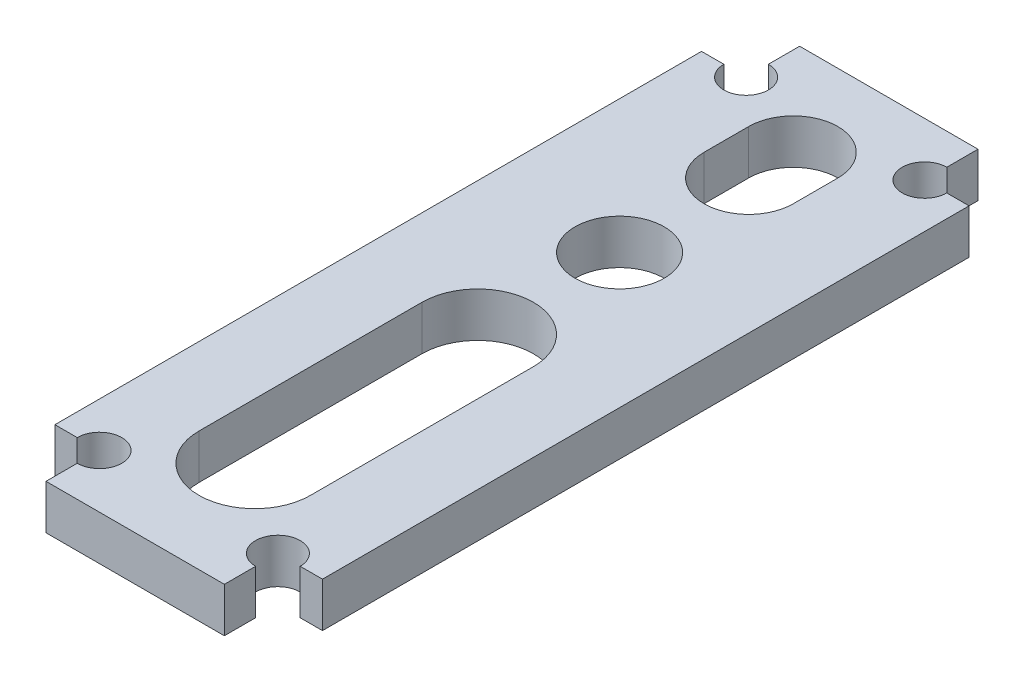
ISO-10303-21;
HEADER;
FILE_DESCRIPTION(('STEP AP214'),'2;1');
FILE_NAME('part.step','',(''),(''),'','','');
FILE_SCHEMA(('AUTOMOTIVE_DESIGN { 1 0 10303 214 1 1 1 1 }'));
ENDSEC;
DATA;
#1=APPLICATION_CONTEXT('core data for automotive mechanical design processes');
#2=APPLICATION_PROTOCOL_DEFINITION('international standard','automotive_design',2000,#1);
#3=PRODUCT_CONTEXT('',#1,'mechanical');
#4=PRODUCT('Part','Part','',(#3));
#5=PRODUCT_RELATED_PRODUCT_CATEGORY('part','',(#4));
#6=PRODUCT_DEFINITION_FORMATION('','',#4);
#7=PRODUCT_DEFINITION_CONTEXT('part definition',#1,'design');
#8=PRODUCT_DEFINITION('design','',#6,#7);
#9=PRODUCT_DEFINITION_SHAPE('','',#8);
#10=(LENGTH_UNIT() NAMED_UNIT(*) SI_UNIT(.MILLI.,.METRE.));
#11=(NAMED_UNIT(*) PLANE_ANGLE_UNIT() SI_UNIT($,.RADIAN.));
#12=(NAMED_UNIT(*) SI_UNIT($,.STERADIAN.) SOLID_ANGLE_UNIT());
#13=UNCERTAINTY_MEASURE_WITH_UNIT(LENGTH_MEASURE(1.E-05),#10,'distance_accuracy_value','');
#14=(GEOMETRIC_REPRESENTATION_CONTEXT(3) GLOBAL_UNCERTAINTY_ASSIGNED_CONTEXT((#13)) GLOBAL_UNIT_ASSIGNED_CONTEXT((#10,
#11,#12)) REPRESENTATION_CONTEXT('',''));
#15=CARTESIAN_POINT('',(0.,0.,0.));
#16=DIRECTION('',(0.,0.,1.));
#17=DIRECTION('',(1.,0.,0.));
#18=AXIS2_PLACEMENT_3D('',#15,#16,#17);
#19=CARTESIAN_POINT('',(1.99999999999987,1.,-15.3877447895864));
#20=DIRECTION('',(0.,-1.,0.));
#21=DIRECTION('',(0.,0.,-1.));
#22=AXIS2_PLACEMENT_3D('',#19,#20,#21);
#23=CYLINDRICAL_SURFACE('',#22,0.5);
#24=CARTESIAN_POINT('',(1.99999999999987,0.,-15.3877447895864));
#25=DIRECTION('',(0.,1.,0.));
#26=DIRECTION('',(0.,0.,1.));
#27=AXIS2_PLACEMENT_3D('',#24,#25,#26);
#28=CIRCLE('',#27,0.5);
#29=CARTESIAN_POINT('',(1.99999999999992,0.,-15.8877447895864));
#30=VERTEX_POINT('',#29);
#31=CARTESIAN_POINT('',(2.49999999999987,0.,-15.3877447895864));
#32=VERTEX_POINT('',#31);
#33=EDGE_CURVE('E316',#30,#32,#28,.T.);
#34=ORIENTED_EDGE('',*,*,#33,.F.);
#35=DIRECTION('',(0.,-1.,0.));
#36=VECTOR('',#35,1.);
#37=CARTESIAN_POINT('',(1.99999999999992,1.,-15.8877447895864));
#38=LINE('',#37,#36);
#39=CARTESIAN_POINT('',(1.99999999999992,1.,-15.8877447895864));
#40=VERTEX_POINT('',#39);
#41=EDGE_CURVE('E11',#40,#30,#38,.T.);
#42=ORIENTED_EDGE('',*,*,#41,.F.);
#43=CARTESIAN_POINT('',(1.99999999999987,1.,-15.3877447895864));
#44=DIRECTION('',(0.,1.,0.));
#45=DIRECTION('',(0.,0.,1.));
#46=AXIS2_PLACEMENT_3D('',#43,#44,#45);
#47=CIRCLE('',#46,0.5);
#48=CARTESIAN_POINT('',(2.49999999999987,1.,-15.3877447895864));
#49=VERTEX_POINT('',#48);
#50=EDGE_CURVE('E383',#40,#49,#47,.T.);
#51=ORIENTED_EDGE('',*,*,#50,.T.);
#52=DIRECTION('',(0.,-1.,0.));
#53=VECTOR('',#52,1.);
#54=CARTESIAN_POINT('',(2.49999999999987,1.,-15.3877447895864));
#55=LINE('',#54,#53);
#56=EDGE_CURVE('E62',#49,#32,#55,.T.);
#57=ORIENTED_EDGE('',*,*,#56,.T.);
#58=EDGE_LOOP('',(#34,#42,#51,#57));
#59=FACE_BOUND('',#58,.T.);
#60=ADVANCED_FACE('F43',(#59),#23,.F.);
#61=CARTESIAN_POINT('',(1.99999999999991,1.,0.));
#62=DIRECTION('',(1.,0.,0.));
#63=DIRECTION('',(0.,0.,-1.));
#64=AXIS2_PLACEMENT_3D('',#61,#62,#63);
#65=PLANE('',#64);
#66=DIRECTION('',(0.,0.,1.));
#67=VECTOR('',#66,1.);
#68=CARTESIAN_POINT('',(1.99999999999991,0.,0.));
#69=LINE('',#68,#67);
#70=CARTESIAN_POINT('',(1.99999999999992,0.,-16.5877447895851));
#71=VERTEX_POINT('',#70);
#72=EDGE_CURVE('E318',#71,#30,#69,.T.);
#73=ORIENTED_EDGE('',*,*,#72,.F.);
#74=DIRECTION('',(0.,-1.,0.));
#75=VECTOR('',#74,1.);
#76=CARTESIAN_POINT('',(1.99999999999992,1.,-16.5877447895851));
#77=LINE('',#76,#75);
#78=CARTESIAN_POINT('',(1.99999999999992,1.,-16.5877447895851));
#79=VERTEX_POINT('',#78);
#80=EDGE_CURVE('E53',#79,#71,#77,.T.);
#81=ORIENTED_EDGE('',*,*,#80,.F.);
#82=DIRECTION('',(0.,0.,1.));
#83=VECTOR('',#82,1.);
#84=CARTESIAN_POINT('',(1.99999999999991,1.,0.));
#85=LINE('',#84,#83);
#86=EDGE_CURVE('E385',#79,#40,#85,.T.);
#87=ORIENTED_EDGE('',*,*,#86,.T.);
#88=ORIENTED_EDGE('',*,*,#41,.T.);
#89=EDGE_LOOP('',(#73,#81,#87,#88));
#90=FACE_BOUND('',#89,.T.);
#91=ADVANCED_FACE('F434',(#90),#65,.T.);
#92=CARTESIAN_POINT('',(0.,1.,-16.5877447895851));
#93=DIRECTION('',(0.,0.,-1.));
#94=DIRECTION('',(-1.,0.,0.));
#95=AXIS2_PLACEMENT_3D('',#92,#93,#94);
#96=PLANE('',#95);
#97=DIRECTION('',(1.,0.,0.));
#98=VECTOR('',#97,1.);
#99=CARTESIAN_POINT('',(0.,0.,-16.5877447895851));
#100=LINE('',#99,#98);
#101=CARTESIAN_POINT('',(-2.,0.,-16.5877447895851));
#102=VERTEX_POINT('',#101);
#103=EDGE_CURVE('E321',#102,#71,#100,.T.);
#104=ORIENTED_EDGE('',*,*,#103,.F.);
#105=DIRECTION('',(0.,-1.,0.));
#106=VECTOR('',#105,1.);
#107=CARTESIAN_POINT('',(-2.,1.,-16.5877447895851));
#108=LINE('',#107,#106);
#109=CARTESIAN_POINT('',(-2.,1.,-16.5877447895851));
#110=VERTEX_POINT('',#109);
#111=EDGE_CURVE('E260',#110,#102,#108,.T.);
#112=ORIENTED_EDGE('',*,*,#111,.F.);
#113=DIRECTION('',(1.,0.,0.));
#114=VECTOR('',#113,1.);
#115=CARTESIAN_POINT('',(0.,1.,-16.5877447895851));
#116=LINE('',#115,#114);
#117=EDGE_CURVE('E388',#110,#79,#116,.T.);
#118=ORIENTED_EDGE('',*,*,#117,.T.);
#119=ORIENTED_EDGE('',*,*,#80,.T.);
#120=EDGE_LOOP('',(#104,#112,#118,#119));
#121=FACE_BOUND('',#120,.T.);
#122=ADVANCED_FACE('F439',(#121),#96,.T.);
#123=CARTESIAN_POINT('',(-2.,1.,0.));
#124=DIRECTION('',(-1.,0.,0.));
#125=DIRECTION('',(0.,0.,1.));
#126=AXIS2_PLACEMENT_3D('',#123,#124,#125);
#127=PLANE('',#126);
#128=DIRECTION('',(0.,0.,-1.));
#129=VECTOR('',#128,1.);
#130=CARTESIAN_POINT('',(-2.,0.,0.));
#131=LINE('',#130,#129);
#132=CARTESIAN_POINT('',(-2.,0.,-15.8877447895865));
#133=VERTEX_POINT('',#132);
#134=EDGE_CURVE('E324',#133,#102,#131,.T.);
#135=ORIENTED_EDGE('',*,*,#134,.F.);
#136=DIRECTION('',(0.,-1.,0.));
#137=VECTOR('',#136,1.);
#138=CARTESIAN_POINT('',(-2.,1.,-15.8877447895865));
#139=LINE('',#138,#137);
#140=CARTESIAN_POINT('',(-2.,1.,-15.8877447895865));
#141=VERTEX_POINT('',#140);
#142=EDGE_CURVE('E258',#141,#133,#139,.T.);
#143=ORIENTED_EDGE('',*,*,#142,.F.);
#144=DIRECTION('',(0.,0.,-1.));
#145=VECTOR('',#144,1.);
#146=CARTESIAN_POINT('',(-2.,1.,0.));
#147=LINE('',#146,#145);
#148=EDGE_CURVE('E391',#141,#110,#147,.T.);
#149=ORIENTED_EDGE('',*,*,#148,.T.);
#150=ORIENTED_EDGE('',*,*,#111,.T.);
#151=EDGE_LOOP('',(#135,#143,#149,#150));
#152=FACE_BOUND('',#151,.T.);
#153=ADVANCED_FACE('F583',(#152),#127,.T.);
#154=CARTESIAN_POINT('',(-2.00000000000013,1.,-15.3877447895864));
#155=DIRECTION('',(0.,-1.,0.));
#156=DIRECTION('',(0.,0.,-1.));
#157=AXIS2_PLACEMENT_3D('',#154,#155,#156);
#158=CYLINDRICAL_SURFACE('',#157,0.500000000000018);
#159=CARTESIAN_POINT('',(-2.00000000000013,0.,-15.3877447895864));
#160=DIRECTION('',(0.,1.,0.));
#161=DIRECTION('',(0.,0.,1.));
#162=AXIS2_PLACEMENT_3D('',#159,#160,#161);
#163=CIRCLE('',#162,0.500000000000018);
#164=CARTESIAN_POINT('',(-2.50000000000014,0.,-15.3877447895859));
#165=VERTEX_POINT('',#164);
#166=EDGE_CURVE('E327',#165,#133,#163,.T.);
#167=ORIENTED_EDGE('',*,*,#166,.F.);
#168=DIRECTION('',(0.,-1.,0.));
#169=VECTOR('',#168,1.);
#170=CARTESIAN_POINT('',(-2.50000000000014,1.,-15.3877447895859));
#171=LINE('',#170,#169);
#172=CARTESIAN_POINT('',(-2.50000000000014,1.,-15.3877447895859));
#173=VERTEX_POINT('',#172);
#174=EDGE_CURVE('E256',#173,#165,#171,.T.);
#175=ORIENTED_EDGE('',*,*,#174,.F.);
#176=CARTESIAN_POINT('',(-2.00000000000013,1.,-15.3877447895864));
#177=DIRECTION('',(0.,1.,0.));
#178=DIRECTION('',(0.,0.,1.));
#179=AXIS2_PLACEMENT_3D('',#176,#177,#178);
#180=CIRCLE('',#179,0.500000000000018);
#181=EDGE_CURVE('E394',#173,#141,#180,.T.);
#182=ORIENTED_EDGE('',*,*,#181,.T.);
#183=ORIENTED_EDGE('',*,*,#142,.T.);
#184=EDGE_LOOP('',(#167,#175,#182,#183));
#185=FACE_BOUND('',#184,.T.);
#186=ADVANCED_FACE('F573',(#185),#158,.F.);
#187=CARTESIAN_POINT('',(0.,1.,-15.3877447895859));
#188=DIRECTION('',(0.,0.,-1.));
#189=DIRECTION('',(-1.,0.,0.));
#190=AXIS2_PLACEMENT_3D('',#187,#188,#189);
#191=PLANE('',#190);
#192=DIRECTION('',(1.,0.,0.));
#193=VECTOR('',#192,1.);
#194=CARTESIAN_POINT('',(0.,0.,-15.3877447895859));
#195=LINE('',#194,#193);
#196=CARTESIAN_POINT('',(-3.,0.,-15.3877447895859));
#197=VERTEX_POINT('',#196);
#198=EDGE_CURVE('E330',#197,#165,#195,.T.);
#199=ORIENTED_EDGE('',*,*,#198,.F.);
#200=DIRECTION('',(0.,-1.,0.));
#201=VECTOR('',#200,1.);
#202=CARTESIAN_POINT('',(-3.,1.,-15.3877447895859));
#203=LINE('',#202,#201);
#204=CARTESIAN_POINT('',(-3.,1.,-15.3877447895859));
#205=VERTEX_POINT('',#204);
#206=EDGE_CURVE('E254',#205,#197,#203,.T.);
#207=ORIENTED_EDGE('',*,*,#206,.F.);
#208=DIRECTION('',(1.,0.,0.));
#209=VECTOR('',#208,1.);
#210=CARTESIAN_POINT('',(0.,1.,-15.3877447895859));
#211=LINE('',#210,#209);
#212=EDGE_CURVE('E397',#205,#173,#211,.T.);
#213=ORIENTED_EDGE('',*,*,#212,.T.);
#214=ORIENTED_EDGE('',*,*,#174,.T.);
#215=EDGE_LOOP('',(#199,#207,#213,#214));
#216=FACE_BOUND('',#215,.T.);
#217=ADVANCED_FACE('F564',(#216),#191,.T.);
#218=CARTESIAN_POINT('',(-3.,1.,0.));
#219=DIRECTION('',(-1.,0.,0.));
#220=DIRECTION('',(0.,0.,1.));
#221=AXIS2_PLACEMENT_3D('',#218,#219,#220);
#222=PLANE('',#221);
#223=DIRECTION('',(0.,0.,-1.));
#224=VECTOR('',#223,1.);
#225=CARTESIAN_POINT('',(-3.,0.,0.));
#226=LINE('',#225,#224);
#227=CARTESIAN_POINT('',(-3.,0.,-0.887766191886832));
#228=VERTEX_POINT('',#227);
#229=EDGE_CURVE('E333',#228,#197,#226,.T.);
#230=ORIENTED_EDGE('',*,*,#229,.F.);
#231=DIRECTION('',(0.,-1.,0.));
#232=VECTOR('',#231,1.);
#233=CARTESIAN_POINT('',(-3.,1.,-0.887766191886832));
#234=LINE('',#233,#232);
#235=CARTESIAN_POINT('',(-3.,1.,-0.887766191886832));
#236=VERTEX_POINT('',#235);
#237=EDGE_CURVE('E252',#236,#228,#234,.T.);
#238=ORIENTED_EDGE('',*,*,#237,.F.);
#239=DIRECTION('',(0.,0.,-1.));
#240=VECTOR('',#239,1.);
#241=CARTESIAN_POINT('',(-3.,1.,0.));
#242=LINE('',#241,#240);
#243=EDGE_CURVE('E400',#236,#205,#242,.T.);
#244=ORIENTED_EDGE('',*,*,#243,.T.);
#245=ORIENTED_EDGE('',*,*,#206,.T.);
#246=EDGE_LOOP('',(#230,#238,#244,#245));
#247=FACE_BOUND('',#246,.T.);
#248=ADVANCED_FACE('F555',(#247),#222,.T.);
#249=CARTESIAN_POINT('',(0.,1.,-0.887766191886833));
#250=DIRECTION('',(0.,0.,-1.));
#251=DIRECTION('',(-1.,0.,0.));
#252=AXIS2_PLACEMENT_3D('',#249,#250,#251);
#253=PLANE('',#252);
#254=DIRECTION('',(1.,0.,0.));
#255=VECTOR('',#254,1.);
#256=CARTESIAN_POINT('',(0.,0.,-0.887766191886833));
#257=LINE('',#256,#255);
#258=CARTESIAN_POINT('',(-2.50000000000004,0.,-0.887766191886832));
#259=VERTEX_POINT('',#258);
#260=EDGE_CURVE('E336',#228,#259,#257,.T.);
#261=ORIENTED_EDGE('',*,*,#260,.T.);
#262=DIRECTION('',(0.,-1.,0.));
#263=VECTOR('',#262,1.);
#264=CARTESIAN_POINT('',(-2.50000000000004,1.,-0.887766191886832));
#265=LINE('',#264,#263);
#266=CARTESIAN_POINT('',(-2.50000000000004,1.,-0.887766191886832));
#267=VERTEX_POINT('',#266);
#268=EDGE_CURVE('E250',#267,#259,#265,.T.);
#269=ORIENTED_EDGE('',*,*,#268,.F.);
#270=DIRECTION('',(1.,0.,0.));
#271=VECTOR('',#270,1.);
#272=CARTESIAN_POINT('',(0.,1.,-0.887766191886833));
#273=LINE('',#272,#271);
#274=EDGE_CURVE('E403',#236,#267,#273,.T.);
#275=ORIENTED_EDGE('',*,*,#274,.F.);
#276=ORIENTED_EDGE('',*,*,#237,.T.);
#277=EDGE_LOOP('',(#261,#269,#275,#276));
#278=FACE_BOUND('',#277,.T.);
#279=ADVANCED_FACE('F546',(#278),#253,.F.);
#280=CARTESIAN_POINT('',(-2.00000000000004,1.,-0.887766191886832));
#281=DIRECTION('',(0.,-1.,0.));
#282=DIRECTION('',(0.,0.,-1.));
#283=AXIS2_PLACEMENT_3D('',#280,#281,#282);
#284=CYLINDRICAL_SURFACE('',#283,0.5);
#285=CARTESIAN_POINT('',(-2.00000000000004,0.,-0.887766191886832));
#286=DIRECTION('',(0.,1.,0.));
#287=DIRECTION('',(0.,0.,1.));
#288=AXIS2_PLACEMENT_3D('',#285,#286,#287);
#289=CIRCLE('',#288,0.5);
#290=CARTESIAN_POINT('',(-2.00000000000004,0.,-0.387766191886832));
#291=VERTEX_POINT('',#290);
#292=EDGE_CURVE('E339',#291,#259,#289,.T.);
#293=ORIENTED_EDGE('',*,*,#292,.F.);
#294=DIRECTION('',(0.,-1.,0.));
#295=VECTOR('',#294,1.);
#296=CARTESIAN_POINT('',(-2.00000000000004,1.,-0.387766191886832));
#297=LINE('',#296,#295);
#298=CARTESIAN_POINT('',(-2.00000000000004,1.,-0.387766191886832));
#299=VERTEX_POINT('',#298);
#300=EDGE_CURVE('E248',#299,#291,#297,.T.);
#301=ORIENTED_EDGE('',*,*,#300,.F.);
#302=CARTESIAN_POINT('',(-2.00000000000004,1.,-0.887766191886832));
#303=DIRECTION('',(0.,1.,0.));
#304=DIRECTION('',(0.,0.,1.));
#305=AXIS2_PLACEMENT_3D('',#302,#303,#304);
#306=CIRCLE('',#305,0.5);
#307=EDGE_CURVE('E405',#299,#267,#306,.T.);
#308=ORIENTED_EDGE('',*,*,#307,.T.);
#309=ORIENTED_EDGE('',*,*,#268,.T.);
#310=EDGE_LOOP('',(#293,#301,#308,#309));
#311=FACE_BOUND('',#310,.T.);
#312=ADVANCED_FACE('F537',(#311),#284,.F.);
#313=CARTESIAN_POINT('',(-2.00000000000004,1.,0.));
#314=DIRECTION('',(1.,0.,0.));
#315=DIRECTION('',(0.,0.,-1.));
#316=AXIS2_PLACEMENT_3D('',#313,#314,#315);
#317=PLANE('',#316);
#318=DIRECTION('',(0.,0.,1.));
#319=VECTOR('',#318,1.);
#320=CARTESIAN_POINT('',(-2.00000000000004,0.,0.));
#321=LINE('',#320,#319);
#322=CARTESIAN_POINT('',(-2.00000000000004,0.,0.312233808113167));
#323=VERTEX_POINT('',#322);
#324=EDGE_CURVE('E342',#291,#323,#321,.T.);
#325=ORIENTED_EDGE('',*,*,#324,.T.);
#326=DIRECTION('',(0.,-1.,0.));
#327=VECTOR('',#326,1.);
#328=CARTESIAN_POINT('',(-2.00000000000004,1.,0.312233808113167));
#329=LINE('',#328,#327);
#330=CARTESIAN_POINT('',(-2.00000000000004,1.,0.312233808113167));
#331=VERTEX_POINT('',#330);
#332=EDGE_CURVE('E245',#331,#323,#329,.T.);
#333=ORIENTED_EDGE('',*,*,#332,.F.);
#334=DIRECTION('',(0.,0.,1.));
#335=VECTOR('',#334,1.);
#336=CARTESIAN_POINT('',(-2.00000000000004,1.,0.));
#337=LINE('',#336,#335);
#338=EDGE_CURVE('E408',#299,#331,#337,.T.);
#339=ORIENTED_EDGE('',*,*,#338,.F.);
#340=ORIENTED_EDGE('',*,*,#300,.T.);
#341=EDGE_LOOP('',(#325,#333,#339,#340));
#342=FACE_BOUND('',#341,.T.);
#343=ADVANCED_FACE('F528',(#342),#317,.F.);
#344=CARTESIAN_POINT('',(0.,1.,0.312233808113167));
#345=DIRECTION('',(0.,0.,-1.));
#346=DIRECTION('',(-1.,0.,0.));
#347=AXIS2_PLACEMENT_3D('',#344,#345,#346);
#348=PLANE('',#347);
#349=DIRECTION('',(1.,0.,0.));
#350=VECTOR('',#349,1.);
#351=CARTESIAN_POINT('',(0.,0.,0.312233808113167));
#352=LINE('',#351,#350);
#353=CARTESIAN_POINT('',(2.,0.,0.312233808113167));
#354=VERTEX_POINT('',#353);
#355=EDGE_CURVE('E345',#323,#354,#352,.T.);
#356=ORIENTED_EDGE('',*,*,#355,.T.);
#357=DIRECTION('',(0.,-1.,0.));
#358=VECTOR('',#357,1.);
#359=CARTESIAN_POINT('',(2.,1.,0.312233808113167));
#360=LINE('',#359,#358);
#361=CARTESIAN_POINT('',(2.,1.,0.312233808113167));
#362=VERTEX_POINT('',#361);
#363=EDGE_CURVE('E242',#362,#354,#360,.T.);
#364=ORIENTED_EDGE('',*,*,#363,.F.);
#365=DIRECTION('',(1.,0.,0.));
#366=VECTOR('',#365,1.);
#367=CARTESIAN_POINT('',(0.,1.,0.312233808113167));
#368=LINE('',#367,#366);
#369=EDGE_CURVE('E411',#331,#362,#368,.T.);
#370=ORIENTED_EDGE('',*,*,#369,.F.);
#371=ORIENTED_EDGE('',*,*,#332,.T.);
#372=EDGE_LOOP('',(#356,#364,#370,#371));
#373=FACE_BOUND('',#372,.T.);
#374=ADVANCED_FACE('F519',(#373),#348,.F.);
#375=CARTESIAN_POINT('',(2.,1.,0.));
#376=DIRECTION('',(-1.,0.,0.));
#377=DIRECTION('',(0.,0.,1.));
#378=AXIS2_PLACEMENT_3D('',#375,#376,#377);
#379=PLANE('',#378);
#380=DIRECTION('',(0.,0.,-1.));
#381=VECTOR('',#380,1.);
#382=CARTESIAN_POINT('',(2.,0.,0.));
#383=LINE('',#382,#381);
#384=CARTESIAN_POINT('',(2.,0.,-0.387766191886833));
#385=VERTEX_POINT('',#384);
#386=EDGE_CURVE('E348',#354,#385,#383,.T.);
#387=ORIENTED_EDGE('',*,*,#386,.T.);
#388=DIRECTION('',(0.,-1.,0.));
#389=VECTOR('',#388,1.);
#390=CARTESIAN_POINT('',(2.,1.,-0.387766191886833));
#391=LINE('',#390,#389);
#392=CARTESIAN_POINT('',(2.,1.,-0.387766191886833));
#393=VERTEX_POINT('',#392);
#394=EDGE_CURVE('E236',#393,#385,#391,.T.);
#395=ORIENTED_EDGE('',*,*,#394,.F.);
#396=DIRECTION('',(0.,0.,-1.));
#397=VECTOR('',#396,1.);
#398=CARTESIAN_POINT('',(2.,1.,0.));
#399=LINE('',#398,#397);
#400=EDGE_CURVE('E414',#362,#393,#399,.T.);
#401=ORIENTED_EDGE('',*,*,#400,.F.);
#402=ORIENTED_EDGE('',*,*,#363,.T.);
#403=EDGE_LOOP('',(#387,#395,#401,#402));
#404=FACE_BOUND('',#403,.T.);
#405=ADVANCED_FACE('F510',(#404),#379,.F.);
#406=CARTESIAN_POINT('',(2.,1.,-0.887766191886833));
#407=DIRECTION('',(0.,-1.,0.));
#408=DIRECTION('',(0.,0.,-1.));
#409=AXIS2_PLACEMENT_3D('',#406,#407,#408);
#410=CYLINDRICAL_SURFACE('',#409,0.5);
#411=CARTESIAN_POINT('',(2.,0.,-0.887766191886833));
#412=DIRECTION('',(0.,1.,0.));
#413=DIRECTION('',(0.,0.,1.));
#414=AXIS2_PLACEMENT_3D('',#411,#412,#413);
#415=CIRCLE('',#414,0.5);
#416=CARTESIAN_POINT('',(2.5,0.,-0.887766191886833));
#417=VERTEX_POINT('',#416);
#418=EDGE_CURVE('E351',#417,#385,#415,.T.);
#419=ORIENTED_EDGE('',*,*,#418,.F.);
#420=DIRECTION('',(0.,-1.,0.));
#421=VECTOR('',#420,1.);
#422=CARTESIAN_POINT('',(2.5,1.,-0.887766191886833));
#423=LINE('',#422,#421);
#424=CARTESIAN_POINT('',(2.5,1.,-0.887766191886833));
#425=VERTEX_POINT('',#424);
#426=EDGE_CURVE('E234',#425,#417,#423,.T.);
#427=ORIENTED_EDGE('',*,*,#426,.F.);
#428=CARTESIAN_POINT('',(2.,1.,-0.887766191886833));
#429=DIRECTION('',(0.,1.,0.));
#430=DIRECTION('',(0.,0.,1.));
#431=AXIS2_PLACEMENT_3D('',#428,#429,#430);
#432=CIRCLE('',#431,0.5);
#433=EDGE_CURVE('E228',#425,#393,#432,.T.);
#434=ORIENTED_EDGE('',*,*,#433,.T.);
#435=ORIENTED_EDGE('',*,*,#394,.T.);
#436=EDGE_LOOP('',(#419,#427,#434,#435));
#437=FACE_BOUND('',#436,.T.);
#438=ADVANCED_FACE('F501',(#437),#410,.F.);
#439=CARTESIAN_POINT('',(0.,1.,-0.887766191886833));
#440=DIRECTION('',(0.,0.,-1.));
#441=DIRECTION('',(-1.,0.,0.));
#442=AXIS2_PLACEMENT_3D('',#439,#440,#441);
#443=PLANE('',#442);
#444=DIRECTION('',(1.,0.,0.));
#445=VECTOR('',#444,1.);
#446=CARTESIAN_POINT('',(0.,0.,-0.887766191886833));
#447=LINE('',#446,#445);
#448=CARTESIAN_POINT('',(3.,0.,-0.887766191886833));
#449=VERTEX_POINT('',#448);
#450=EDGE_CURVE('E233',#417,#449,#447,.T.);
#451=ORIENTED_EDGE('',*,*,#450,.T.);
#452=DIRECTION('',(0.,-1.,0.));
#453=VECTOR('',#452,1.);
#454=CARTESIAN_POINT('',(3.,1.,-0.887766191886833));
#455=LINE('',#454,#453);
#456=CARTESIAN_POINT('',(3.,1.,-0.887766191886833));
#457=VERTEX_POINT('',#456);
#458=EDGE_CURVE('E215',#457,#449,#455,.T.);
#459=ORIENTED_EDGE('',*,*,#458,.F.);
#460=DIRECTION('',(1.,0.,0.));
#461=VECTOR('',#460,1.);
#462=CARTESIAN_POINT('',(0.,1.,-0.887766191886833));
#463=LINE('',#462,#461);
#464=EDGE_CURVE('E220',#425,#457,#463,.T.);
#465=ORIENTED_EDGE('',*,*,#464,.F.);
#466=ORIENTED_EDGE('',*,*,#426,.T.);
#467=EDGE_LOOP('',(#451,#459,#465,#466));
#468=FACE_BOUND('',#467,.T.);
#469=ADVANCED_FACE('F231',(#468),#443,.F.);
#470=CARTESIAN_POINT('',(3.,1.,0.));
#471=DIRECTION('',(-1.,0.,0.));
#472=DIRECTION('',(0.,0.,1.));
#473=AXIS2_PLACEMENT_3D('',#470,#471,#472);
#474=PLANE('',#473);
#475=DIRECTION('',(0.,0.,-1.));
#476=VECTOR('',#475,1.);
#477=CARTESIAN_POINT('',(3.,0.,0.));
#478=LINE('',#477,#476);
#479=CARTESIAN_POINT('',(3.,0.,-15.3877447895864));
#480=VERTEX_POINT('',#479);
#481=EDGE_CURVE('E355',#449,#480,#478,.T.);
#482=ORIENTED_EDGE('',*,*,#481,.T.);
#483=DIRECTION('',(0.,-1.,0.));
#484=VECTOR('',#483,1.);
#485=CARTESIAN_POINT('',(3.,1.,-15.3877447895864));
#486=LINE('',#485,#484);
#487=CARTESIAN_POINT('',(3.,1.,-15.3877447895864));
#488=VERTEX_POINT('',#487);
#489=EDGE_CURVE('E136',#488,#480,#486,.T.);
#490=ORIENTED_EDGE('',*,*,#489,.F.);
#491=DIRECTION('',(0.,0.,-1.));
#492=VECTOR('',#491,1.);
#493=CARTESIAN_POINT('',(3.,1.,0.));
#494=LINE('',#493,#492);
#495=EDGE_CURVE('E211',#457,#488,#494,.T.);
#496=ORIENTED_EDGE('',*,*,#495,.F.);
#497=ORIENTED_EDGE('',*,*,#458,.T.);
#498=EDGE_LOOP('',(#482,#490,#496,#497));
#499=FACE_BOUND('',#498,.T.);
#500=ADVANCED_FACE('F213',(#499),#474,.F.);
#501=CARTESIAN_POINT('',(-0.0118291814059923,1.,-7.38054704726461));
#502=DIRECTION('',(0.,-1.,0.));
#503=DIRECTION('',(0.,0.,-1.));
#504=AXIS2_PLACEMENT_3D('',#501,#502,#503);
#505=CYLINDRICAL_SURFACE('',#504,1.25);
#506=CARTESIAN_POINT('',(-0.0118291814059923,0.,-7.38054704726461));
#507=DIRECTION('',(0.,1.,0.));
#508=DIRECTION('',(0.,0.,1.));
#509=AXIS2_PLACEMENT_3D('',#506,#507,#508);
#510=CIRCLE('',#509,1.25);
#511=CARTESIAN_POINT('',(1.23817081859401,0.,-7.38054704726461));
#512=VERTEX_POINT('',#511);
#513=CARTESIAN_POINT('',(-1.26182918140599,0.,-7.38054704726461));
#514=VERTEX_POINT('',#513);
#515=EDGE_CURVE('E304',#512,#514,#510,.T.);
#516=ORIENTED_EDGE('',*,*,#515,.F.);
#517=DIRECTION('',(0.,-1.,0.));
#518=VECTOR('',#517,1.);
#519=CARTESIAN_POINT('',(1.23817081859401,1.,-7.38054704726461));
#520=LINE('',#519,#518);
#521=CARTESIAN_POINT('',(1.23817081859401,1.,-7.38054704726461));
#522=VERTEX_POINT('',#521);
#523=EDGE_CURVE('E269',#522,#512,#520,.T.);
#524=ORIENTED_EDGE('',*,*,#523,.F.);
#525=CARTESIAN_POINT('',(-0.0118291814059923,1.,-7.38054704726461));
#526=DIRECTION('',(0.,1.,0.));
#527=DIRECTION('',(0.,0.,1.));
#528=AXIS2_PLACEMENT_3D('',#525,#526,#527);
#529=CIRCLE('',#528,1.25);
#530=CARTESIAN_POINT('',(-1.26182918140599,1.,-7.38054704726461));
#531=VERTEX_POINT('',#530);
#532=EDGE_CURVE('E372',#522,#531,#529,.T.);
#533=ORIENTED_EDGE('',*,*,#532,.T.);
#534=DIRECTION('',(0.,-1.,0.));
#535=VECTOR('',#534,1.);
#536=CARTESIAN_POINT('',(-1.26182918140599,1.,-7.38054704726461));
#537=LINE('',#536,#535);
#538=EDGE_CURVE('E263',#531,#514,#537,.T.);
#539=ORIENTED_EDGE('',*,*,#538,.T.);
#540=EDGE_LOOP('',(#516,#524,#533,#539));
#541=FACE_BOUND('',#540,.T.);
#542=ADVANCED_FACE('F456',(#541),#505,.F.);
#543=CARTESIAN_POINT('',(1.23817081859401,1.,0.));
#544=DIRECTION('',(-1.,0.,0.));
#545=DIRECTION('',(0.,0.,1.));
#546=AXIS2_PLACEMENT_3D('',#543,#544,#545);
#547=PLANE('',#546);
#548=DIRECTION('',(0.,0.,-1.));
#549=VECTOR('',#548,1.);
#550=CARTESIAN_POINT('',(1.23817081859401,0.,0.));
#551=LINE('',#550,#549);
#552=CARTESIAN_POINT('',(1.23817081859401,0.,-2.38054704726461));
#553=VERTEX_POINT('',#552);
#554=EDGE_CURVE('E307',#553,#512,#551,.T.);
#555=ORIENTED_EDGE('',*,*,#554,.F.);
#556=DIRECTION('',(0.,-1.,0.));
#557=VECTOR('',#556,1.);
#558=CARTESIAN_POINT('',(1.23817081859401,1.,-2.38054704726461));
#559=LINE('',#558,#557);
#560=CARTESIAN_POINT('',(1.23817081859401,1.,-2.38054704726461));
#561=VERTEX_POINT('',#560);
#562=EDGE_CURVE('E267',#561,#553,#559,.T.);
#563=ORIENTED_EDGE('',*,*,#562,.F.);
#564=DIRECTION('',(0.,0.,-1.));
#565=VECTOR('',#564,1.);
#566=CARTESIAN_POINT('',(1.23817081859401,1.,0.));
#567=LINE('',#566,#565);
#568=EDGE_CURVE('E375',#561,#522,#567,.T.);
#569=ORIENTED_EDGE('',*,*,#568,.T.);
#570=ORIENTED_EDGE('',*,*,#523,.T.);
#571=EDGE_LOOP('',(#555,#563,#569,#570));
#572=FACE_BOUND('',#571,.T.);
#573=ADVANCED_FACE('F452',(#572),#547,.T.);
#574=CARTESIAN_POINT('',(-0.0118291814059923,1.,-2.38054704726461));
#575=DIRECTION('',(0.,-1.,0.));
#576=DIRECTION('',(0.,0.,-1.));
#577=AXIS2_PLACEMENT_3D('',#574,#575,#576);
#578=CYLINDRICAL_SURFACE('',#577,1.25);
#579=CARTESIAN_POINT('',(-0.0118291814059923,0.,-2.38054704726461));
#580=DIRECTION('',(0.,1.,0.));
#581=DIRECTION('',(0.,0.,1.));
#582=AXIS2_PLACEMENT_3D('',#579,#580,#581);
#583=CIRCLE('',#582,1.25);
#584=CARTESIAN_POINT('',(-1.26182918140599,0.,-2.38054704726461));
#585=VERTEX_POINT('',#584);
#586=EDGE_CURVE('E310',#585,#553,#583,.T.);
#587=ORIENTED_EDGE('',*,*,#586,.F.);
#588=DIRECTION('',(0.,-1.,0.));
#589=VECTOR('',#588,1.);
#590=CARTESIAN_POINT('',(-1.26182918140599,1.,-2.38054704726461));
#591=LINE('',#590,#589);
#592=CARTESIAN_POINT('',(-1.26182918140599,1.,-2.38054704726461));
#593=VERTEX_POINT('',#592);
#594=EDGE_CURVE('E265',#593,#585,#591,.T.);
#595=ORIENTED_EDGE('',*,*,#594,.F.);
#596=CARTESIAN_POINT('',(-0.0118291814059923,1.,-2.38054704726461));
#597=DIRECTION('',(0.,1.,0.));
#598=DIRECTION('',(0.,0.,1.));
#599=AXIS2_PLACEMENT_3D('',#596,#597,#598);
#600=CIRCLE('',#599,1.25);
#601=EDGE_CURVE('E378',#593,#561,#600,.T.);
#602=ORIENTED_EDGE('',*,*,#601,.T.);
#603=ORIENTED_EDGE('',*,*,#562,.T.);
#604=EDGE_LOOP('',(#587,#595,#602,#603));
#605=FACE_BOUND('',#604,.T.);
#606=ADVANCED_FACE('F449',(#605),#578,.F.);
#607=CARTESIAN_POINT('',(-0.0118291814059923,1.,-14.4567059270375));
#608=DIRECTION('',(0.,-1.,0.));
#609=DIRECTION('',(0.,0.,-1.));
#610=AXIS2_PLACEMENT_3D('',#607,#608,#609);
#611=CYLINDRICAL_SURFACE('',#610,1.);
#612=CARTESIAN_POINT('',(-0.0118291814059923,0.,-14.4567059270375));
#613=DIRECTION('',(0.,1.,0.));
#614=DIRECTION('',(0.,0.,1.));
#615=AXIS2_PLACEMENT_3D('',#612,#613,#614);
#616=CIRCLE('',#615,1.);
#617=CARTESIAN_POINT('',(0.988170818594008,0.,-14.4567059270375));
#618=VERTEX_POINT('',#617);
#619=CARTESIAN_POINT('',(-1.01182918140599,0.,-14.4567059270375));
#620=VERTEX_POINT('',#619);
#621=EDGE_CURVE('E289',#618,#620,#616,.T.);
#622=ORIENTED_EDGE('',*,*,#621,.F.);
#623=DIRECTION('',(0.,-1.,0.));
#624=VECTOR('',#623,1.);
#625=CARTESIAN_POINT('',(0.988170818594008,1.,-14.4567059270375));
#626=LINE('',#625,#624);
#627=CARTESIAN_POINT('',(0.988170818594008,1.,-14.4567059270375));
#628=VERTEX_POINT('',#627);
#629=EDGE_CURVE('E47',#628,#618,#626,.T.);
#630=ORIENTED_EDGE('',*,*,#629,.F.);
#631=CARTESIAN_POINT('',(-0.0118291814059923,1.,-14.4567059270375));
#632=DIRECTION('',(0.,1.,0.));
#633=DIRECTION('',(0.,0.,1.));
#634=AXIS2_PLACEMENT_3D('',#631,#632,#633);
#635=CIRCLE('',#634,1.);
#636=CARTESIAN_POINT('',(-1.01182918140599,1.,-14.4567059270375));
#637=VERTEX_POINT('',#636);
#638=EDGE_CURVE('E362',#628,#637,#635,.T.);
#639=ORIENTED_EDGE('',*,*,#638,.T.);
#640=DIRECTION('',(0.,-1.,0.));
#641=VECTOR('',#640,1.);
#642=CARTESIAN_POINT('',(-1.01182918140599,1.,-14.4567059270375));
#643=LINE('',#642,#641);
#644=EDGE_CURVE('E271',#637,#620,#643,.T.);
#645=ORIENTED_EDGE('',*,*,#644,.T.);
#646=EDGE_LOOP('',(#622,#630,#639,#645));
#647=FACE_BOUND('',#646,.T.);
#648=ADVANCED_FACE('F45',(#647),#611,.F.);
#649=CARTESIAN_POINT('',(0.988170818594008,1.,0.));
#650=DIRECTION('',(-1.,0.,0.));
#651=DIRECTION('',(0.,0.,1.));
#652=AXIS2_PLACEMENT_3D('',#649,#650,#651);
#653=PLANE('',#652);
#654=DIRECTION('',(0.,0.,-1.));
#655=VECTOR('',#654,1.);
#656=CARTESIAN_POINT('',(0.988170818594008,0.,0.));
#657=LINE('',#656,#655);
#658=CARTESIAN_POINT('',(0.988170818594008,0.,-13.4567059270375));
#659=VERTEX_POINT('',#658);
#660=EDGE_CURVE('E284',#659,#618,#657,.T.);
#661=ORIENTED_EDGE('',*,*,#660,.F.);
#662=DIRECTION('',(0.,-1.,0.));
#663=VECTOR('',#662,1.);
#664=CARTESIAN_POINT('',(0.988170818594008,1.,-13.4567059270375));
#665=LINE('',#664,#663);
#666=CARTESIAN_POINT('',(0.988170818594008,1.,-13.4567059270375));
#667=VERTEX_POINT('',#666);
#668=EDGE_CURVE('E275',#667,#659,#665,.T.);
#669=ORIENTED_EDGE('',*,*,#668,.F.);
#670=DIRECTION('',(0.,0.,-1.));
#671=VECTOR('',#670,1.);
#672=CARTESIAN_POINT('',(0.988170818594008,1.,0.));
#673=LINE('',#672,#671);
#674=EDGE_CURVE('E287',#667,#628,#673,.T.);
#675=ORIENTED_EDGE('',*,*,#674,.T.);
#676=ORIENTED_EDGE('',*,*,#629,.T.);
#677=EDGE_LOOP('',(#661,#669,#675,#676));
#678=FACE_BOUND('',#677,.T.);
#679=ADVANCED_FACE('F282',(#678),#653,.T.);
#680=CARTESIAN_POINT('',(-0.0118291814059923,1.,-13.4567059270375));
#681=DIRECTION('',(0.,-1.,0.));
#682=DIRECTION('',(0.,0.,-1.));
#683=AXIS2_PLACEMENT_3D('',#680,#681,#682);
#684=CYLINDRICAL_SURFACE('',#683,1.);
#685=CARTESIAN_POINT('',(-0.0118291814059923,0.,-13.4567059270375));
#686=DIRECTION('',(0.,1.,0.));
#687=DIRECTION('',(0.,0.,1.));
#688=AXIS2_PLACEMENT_3D('',#685,#686,#687);
#689=CIRCLE('',#688,1.);
#690=CARTESIAN_POINT('',(-1.01182918140599,0.,-13.4567059270375));
#691=VERTEX_POINT('',#690);
#692=EDGE_CURVE('E297',#691,#659,#689,.T.);
#693=ORIENTED_EDGE('',*,*,#692,.F.);
#694=DIRECTION('',(0.,-1.,0.));
#695=VECTOR('',#694,1.);
#696=CARTESIAN_POINT('',(-1.01182918140599,1.,-13.4567059270375));
#697=LINE('',#696,#695);
#698=CARTESIAN_POINT('',(-1.01182918140599,1.,-13.4567059270375));
#699=VERTEX_POINT('',#698);
#700=EDGE_CURVE('E273',#699,#691,#697,.T.);
#701=ORIENTED_EDGE('',*,*,#700,.F.);
#702=CARTESIAN_POINT('',(-0.0118291814059923,1.,-13.4567059270375));
#703=DIRECTION('',(0.,1.,0.));
#704=DIRECTION('',(0.,0.,1.));
#705=AXIS2_PLACEMENT_3D('',#702,#703,#704);
#706=CIRCLE('',#705,1.);
#707=EDGE_CURVE('E366',#699,#667,#706,.T.);
#708=ORIENTED_EDGE('',*,*,#707,.T.);
#709=ORIENTED_EDGE('',*,*,#668,.T.);
#710=EDGE_LOOP('',(#693,#701,#708,#709));
#711=FACE_BOUND('',#710,.T.);
#712=ADVANCED_FACE('F464',(#711),#684,.F.);
#713=CARTESIAN_POINT('',(0.,1.,-15.3877447895864));
#714=DIRECTION('',(0.,0.,-1.));
#715=DIRECTION('',(-1.,0.,0.));
#716=AXIS2_PLACEMENT_3D('',#713,#714,#715);
#717=PLANE('',#716);
#718=DIRECTION('',(1.,0.,0.));
#719=VECTOR('',#718,1.);
#720=CARTESIAN_POINT('',(0.,0.,-15.3877447895864));
#721=LINE('',#720,#719);
#722=EDGE_CURVE('E357',#32,#480,#721,.T.);
#723=ORIENTED_EDGE('',*,*,#722,.F.);
#724=ORIENTED_EDGE('',*,*,#56,.F.);
#725=DIRECTION('',(1.,0.,0.));
#726=VECTOR('',#725,1.);
#727=CARTESIAN_POINT('',(0.,1.,-15.3877447895864));
#728=LINE('',#727,#726);
#729=EDGE_CURVE('E219',#49,#488,#728,.T.);
#730=ORIENTED_EDGE('',*,*,#729,.T.);
#731=ORIENTED_EDGE('',*,*,#489,.T.);
#732=EDGE_LOOP('',(#723,#724,#730,#731));
#733=FACE_BOUND('',#732,.T.);
#734=ADVANCED_FACE('F447',(#733),#717,.T.);
#735=CARTESIAN_POINT('',(-1.26182918140599,1.,0.));
#736=DIRECTION('',(-1.,0.,0.));
#737=DIRECTION('',(0.,0.,1.));
#738=AXIS2_PLACEMENT_3D('',#735,#736,#737);
#739=PLANE('',#738);
#740=DIRECTION('',(0.,0.,-1.));
#741=VECTOR('',#740,1.);
#742=CARTESIAN_POINT('',(-1.26182918140599,0.,0.));
#743=LINE('',#742,#741);
#744=EDGE_CURVE('E313',#585,#514,#743,.T.);
#745=ORIENTED_EDGE('',*,*,#744,.T.);
#746=ORIENTED_EDGE('',*,*,#538,.F.);
#747=DIRECTION('',(0.,0.,-1.));
#748=VECTOR('',#747,1.);
#749=CARTESIAN_POINT('',(-1.26182918140599,1.,0.));
#750=LINE('',#749,#748);
#751=EDGE_CURVE('E381',#593,#531,#750,.T.);
#752=ORIENTED_EDGE('',*,*,#751,.F.);
#753=ORIENTED_EDGE('',*,*,#594,.T.);
#754=EDGE_LOOP('',(#745,#746,#752,#753));
#755=FACE_BOUND('',#754,.T.);
#756=ADVANCED_FACE('F444',(#755),#739,.F.);
#757=CARTESIAN_POINT('',(-1.01182918140599,1.,0.));
#758=DIRECTION('',(-1.,0.,0.));
#759=DIRECTION('',(0.,0.,1.));
#760=AXIS2_PLACEMENT_3D('',#757,#758,#759);
#761=PLANE('',#760);
#762=DIRECTION('',(0.,0.,-1.));
#763=VECTOR('',#762,1.);
#764=CARTESIAN_POINT('',(-1.01182918140599,0.,0.));
#765=LINE('',#764,#763);
#766=EDGE_CURVE('E299',#691,#620,#765,.T.);
#767=ORIENTED_EDGE('',*,*,#766,.T.);
#768=ORIENTED_EDGE('',*,*,#644,.F.);
#769=DIRECTION('',(0.,0.,-1.));
#770=VECTOR('',#769,1.);
#771=CARTESIAN_POINT('',(-1.01182918140599,1.,0.));
#772=LINE('',#771,#770);
#773=EDGE_CURVE('E370',#699,#637,#772,.T.);
#774=ORIENTED_EDGE('',*,*,#773,.F.);
#775=ORIENTED_EDGE('',*,*,#700,.T.);
#776=EDGE_LOOP('',(#767,#768,#774,#775));
#777=FACE_BOUND('',#776,.T.);
#778=ADVANCED_FACE('F430',(#777),#761,.F.);
#779=CARTESIAN_POINT('',(-0.0118291814059923,1.,-10.562782388543));
#780=DIRECTION('',(0.,-1.,0.));
#781=DIRECTION('',(0.,0.,-1.));
#782=AXIS2_PLACEMENT_3D('',#779,#780,#781);
#783=CYLINDRICAL_SURFACE('',#782,1.);
#784=CARTESIAN_POINT('',(-0.0118291814059923,1.,-10.562782388543));
#785=DIRECTION('',(0.,1.,0.));
#786=DIRECTION('',(0.,0.,1.));
#787=AXIS2_PLACEMENT_3D('',#784,#785,#786);
#788=CIRCLE('',#787,1.);
#789=CARTESIAN_POINT('',(-0.0118291814059923,1.,-9.56278238854303));
#790=VERTEX_POINT('',#789);
#791=EDGE_CURVE('E274',#790,#790,#788,.T.);
#792=ORIENTED_EDGE('',*,*,#791,.T.);
#793=EDGE_LOOP('',(#792));
#794=FACE_BOUND('',#793,.T.);
#795=CARTESIAN_POINT('',(-0.0118291814059923,0.,-10.562782388543));
#796=DIRECTION('',(0.,1.,0.));
#797=DIRECTION('',(0.,0.,1.));
#798=AXIS2_PLACEMENT_3D('',#795,#796,#797);
#799=CIRCLE('',#798,1.);
#800=CARTESIAN_POINT('',(-0.0118291814059923,0.,-9.56278238854303));
#801=VERTEX_POINT('',#800);
#802=EDGE_CURVE('E360',#801,#801,#799,.T.);
#803=ORIENTED_EDGE('',*,*,#802,.F.);
#804=EDGE_LOOP('',(#803));
#805=FACE_BOUND('',#804,.T.);
#806=ADVANCED_FACE('F420',(#794,#805),#783,.F.);
#807=CARTESIAN_POINT('',(0.,1.,0.));
#808=DIRECTION('',(0.,1.,0.));
#809=DIRECTION('',(0.,0.,1.));
#810=AXIS2_PLACEMENT_3D('',#807,#808,#809);
#811=PLANE('',#810);
#812=ORIENTED_EDGE('',*,*,#638,.F.);
#813=ORIENTED_EDGE('',*,*,#674,.F.);
#814=ORIENTED_EDGE('',*,*,#707,.F.);
#815=ORIENTED_EDGE('',*,*,#773,.T.);
#816=EDGE_LOOP('',(#812,#813,#814,#815));
#817=FACE_BOUND('',#816,.T.);
#818=ORIENTED_EDGE('',*,*,#532,.F.);
#819=ORIENTED_EDGE('',*,*,#568,.F.);
#820=ORIENTED_EDGE('',*,*,#601,.F.);
#821=ORIENTED_EDGE('',*,*,#751,.T.);
#822=EDGE_LOOP('',(#818,#819,#820,#821));
#823=FACE_BOUND('',#822,.T.);
#824=ORIENTED_EDGE('',*,*,#50,.F.);
#825=ORIENTED_EDGE('',*,*,#86,.F.);
#826=ORIENTED_EDGE('',*,*,#117,.F.);
#827=ORIENTED_EDGE('',*,*,#148,.F.);
#828=ORIENTED_EDGE('',*,*,#181,.F.);
#829=ORIENTED_EDGE('',*,*,#212,.F.);
#830=ORIENTED_EDGE('',*,*,#243,.F.);
#831=ORIENTED_EDGE('',*,*,#274,.T.);
#832=ORIENTED_EDGE('',*,*,#307,.F.);
#833=ORIENTED_EDGE('',*,*,#338,.T.);
#834=ORIENTED_EDGE('',*,*,#369,.T.);
#835=ORIENTED_EDGE('',*,*,#400,.T.);
#836=ORIENTED_EDGE('',*,*,#433,.F.);
#837=ORIENTED_EDGE('',*,*,#464,.T.);
#838=ORIENTED_EDGE('',*,*,#495,.T.);
#839=ORIENTED_EDGE('',*,*,#729,.F.);
#840=EDGE_LOOP('',(#824,#825,#826,#827,#828,#829,#830,#831,#832,#833,#834,#835,#836,#837,#838,#839));
#841=FACE_BOUND('',#840,.T.);
#842=ORIENTED_EDGE('',*,*,#791,.F.);
#843=EDGE_LOOP('',(#842));
#844=FACE_BOUND('',#843,.T.);
#845=ADVANCED_FACE('F225',(#817,#823,#841,#844),#811,.T.);
#846=CARTESIAN_POINT('',(0.,0.,0.));
#847=DIRECTION('',(0.,1.,0.));
#848=DIRECTION('',(0.,0.,1.));
#849=AXIS2_PLACEMENT_3D('',#846,#847,#848);
#850=PLANE('',#849);
#851=ORIENTED_EDGE('',*,*,#621,.T.);
#852=ORIENTED_EDGE('',*,*,#766,.F.);
#853=ORIENTED_EDGE('',*,*,#692,.T.);
#854=ORIENTED_EDGE('',*,*,#660,.T.);
#855=EDGE_LOOP('',(#851,#852,#853,#854));
#856=FACE_BOUND('',#855,.T.);
#857=ORIENTED_EDGE('',*,*,#515,.T.);
#858=ORIENTED_EDGE('',*,*,#744,.F.);
#859=ORIENTED_EDGE('',*,*,#586,.T.);
#860=ORIENTED_EDGE('',*,*,#554,.T.);
#861=EDGE_LOOP('',(#857,#858,#859,#860));
#862=FACE_BOUND('',#861,.T.);
#863=ORIENTED_EDGE('',*,*,#33,.T.);
#864=ORIENTED_EDGE('',*,*,#722,.T.);
#865=ORIENTED_EDGE('',*,*,#481,.F.);
#866=ORIENTED_EDGE('',*,*,#450,.F.);
#867=ORIENTED_EDGE('',*,*,#418,.T.);
#868=ORIENTED_EDGE('',*,*,#386,.F.);
#869=ORIENTED_EDGE('',*,*,#355,.F.);
#870=ORIENTED_EDGE('',*,*,#324,.F.);
#871=ORIENTED_EDGE('',*,*,#292,.T.);
#872=ORIENTED_EDGE('',*,*,#260,.F.);
#873=ORIENTED_EDGE('',*,*,#229,.T.);
#874=ORIENTED_EDGE('',*,*,#198,.T.);
#875=ORIENTED_EDGE('',*,*,#166,.T.);
#876=ORIENTED_EDGE('',*,*,#134,.T.);
#877=ORIENTED_EDGE('',*,*,#103,.T.);
#878=ORIENTED_EDGE('',*,*,#72,.T.);
#879=EDGE_LOOP('',(#863,#864,#865,#866,#867,#868,#869,#870,#871,#872,#873,#874,#875,#876,#877,#878));
#880=FACE_BOUND('',#879,.T.);
#881=ORIENTED_EDGE('',*,*,#802,.T.);
#882=EDGE_LOOP('',(#881));
#883=FACE_BOUND('',#882,.T.);
#884=ADVANCED_FACE('F295',(#856,#862,#880,#883),#850,.F.);
#885=CLOSED_SHELL('',(#60,#91,#122,#153,#186,#217,#248,#279,#312,#343,#374,#405,#438,#469,#500,
#542,#573,#606,#648,#679,#712,#734,#756,#778,#806,#845,#884));
#886=MANIFOLD_SOLID_BREP('B2',#885);
#887=ADVANCED_BREP_SHAPE_REPRESENTATION('',(#18,#886),#14);
#888=SHAPE_DEFINITION_REPRESENTATION(#9,#887);
ENDSEC;
END-ISO-10303-21;
